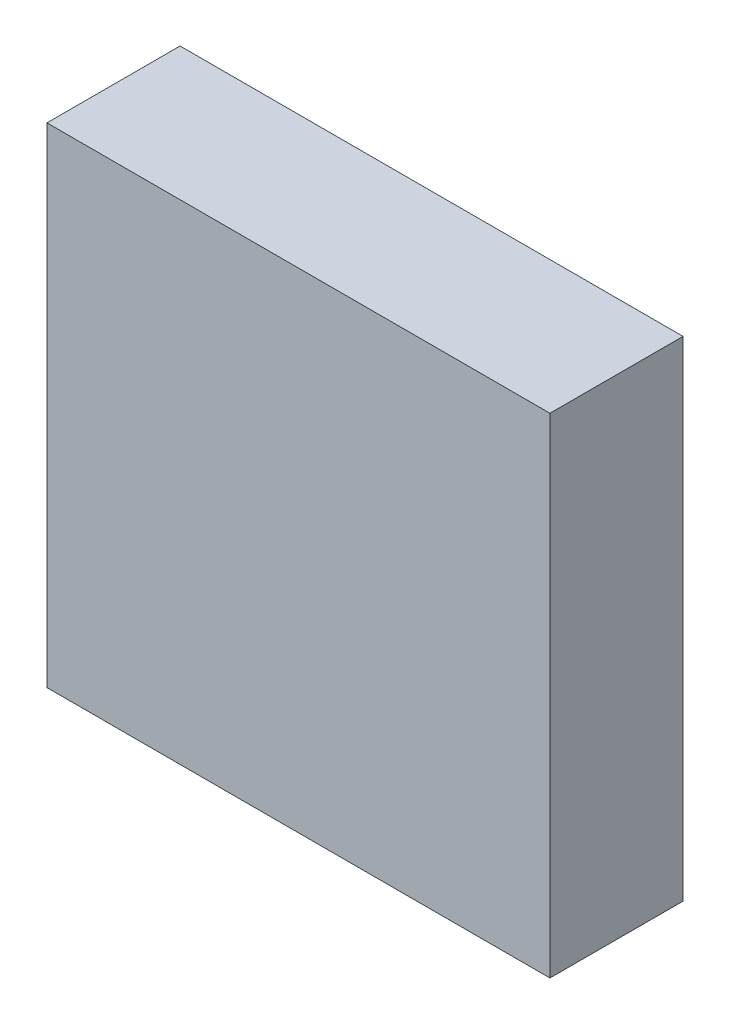
ISO-10303-21;
HEADER;
FILE_DESCRIPTION(('STEP AP214'),'2;1');
FILE_NAME('part.step','',(''),(''),'','','');
FILE_SCHEMA(('AUTOMOTIVE_DESIGN { 1 0 10303 214 1 1 1 1 }'));
ENDSEC;
DATA;
#1=APPLICATION_CONTEXT('core data for automotive mechanical design processes');
#2=APPLICATION_PROTOCOL_DEFINITION('international standard','automotive_design',2000,#1);
#3=PRODUCT_CONTEXT('',#1,'mechanical');
#4=PRODUCT('Part','Part','',(#3));
#5=PRODUCT_RELATED_PRODUCT_CATEGORY('part','',(#4));
#6=PRODUCT_DEFINITION_FORMATION('','',#4);
#7=PRODUCT_DEFINITION_CONTEXT('part definition',#1,'design');
#8=PRODUCT_DEFINITION('design','',#6,#7);
#9=PRODUCT_DEFINITION_SHAPE('','',#8);
#10=(LENGTH_UNIT() NAMED_UNIT(*) SI_UNIT(.MILLI.,.METRE.));
#11=(NAMED_UNIT(*) PLANE_ANGLE_UNIT() SI_UNIT($,.RADIAN.));
#12=(NAMED_UNIT(*) SI_UNIT($,.STERADIAN.) SOLID_ANGLE_UNIT());
#13=UNCERTAINTY_MEASURE_WITH_UNIT(LENGTH_MEASURE(1.E-05),#10,'distance_accuracy_value','');
#14=(GEOMETRIC_REPRESENTATION_CONTEXT(3) GLOBAL_UNCERTAINTY_ASSIGNED_CONTEXT((#13)) GLOBAL_UNIT_ASSIGNED_CONTEXT((#10,
#11,#12)) REPRESENTATION_CONTEXT('',''));
#15=CARTESIAN_POINT('',(0.,0.,0.));
#16=DIRECTION('',(0.,0.,1.));
#17=DIRECTION('',(1.,0.,0.));
#18=AXIS2_PLACEMENT_3D('',#15,#16,#17);
#19=CARTESIAN_POINT('',(1.439738379477,-1.399987299975,0.762001524003));
#20=DIRECTION('',(0.,0.,1.));
#21=DIRECTION('',(0.,1.,0.));
#22=AXIS2_PLACEMENT_3D('',#19,#20,#21);
#23=PLANE('',#22);
#24=DIRECTION('',(1.,0.,0.));
#25=VECTOR('',#24,1.);
#26=CARTESIAN_POINT('',(1.27000254999954E-05,1.400012700025,0.762001524003));
#27=LINE('',#26,#25);
#28=CARTESIAN_POINT('',(-1.439712979426,1.400012700025,0.762001524003));
#29=VERTEX_POINT('',#28);
#30=CARTESIAN_POINT('',(1.439738379477,1.400012700025,0.762001524003));
#31=VERTEX_POINT('',#30);
#32=EDGE_CURVE('E77',#29,#31,#27,.T.);
#33=ORIENTED_EDGE('',*,*,#32,.F.);
#34=DIRECTION('',(0.,1.,0.));
#35=VECTOR('',#34,1.);
#36=CARTESIAN_POINT('',(-1.439712979426,1.27000249999613E-05,0.762001524003));
#37=LINE('',#36,#35);
#38=CARTESIAN_POINT('',(-1.439712979426,-1.399987299975,0.762001524003));
#39=VERTEX_POINT('',#38);
#40=EDGE_CURVE('E59',#39,#29,#37,.T.);
#41=ORIENTED_EDGE('',*,*,#40,.F.);
#42=DIRECTION('',(1.,0.,0.));
#43=VECTOR('',#42,1.);
#44=CARTESIAN_POINT('',(1.27000254999954E-05,-1.399987299975,0.762001524003));
#45=LINE('',#44,#43);
#46=CARTESIAN_POINT('',(1.439738379477,-1.399987299975,0.762001524003));
#47=VERTEX_POINT('',#46);
#48=EDGE_CURVE('E21',#39,#47,#45,.T.);
#49=ORIENTED_EDGE('',*,*,#48,.T.);
#50=DIRECTION('',(0.,1.,0.));
#51=VECTOR('',#50,1.);
#52=CARTESIAN_POINT('',(1.439738379477,1.27000249999613E-05,0.762001524003));
#53=LINE('',#52,#51);
#54=EDGE_CURVE('E56',#47,#31,#53,.T.);
#55=ORIENTED_EDGE('',*,*,#54,.T.);
#56=EDGE_LOOP('',(#33,#41,#49,#55));
#57=FACE_BOUND('',#56,.T.);
#58=ADVANCED_FACE('F17',(#57),#23,.T.);
#59=CARTESIAN_POINT('',(-1.439712979426,-1.399987299975,0.));
#60=DIRECTION('',(0.,1.,0.));
#61=DIRECTION('',(0.,0.,1.));
#62=AXIS2_PLACEMENT_3D('',#59,#60,#61);
#63=PLANE('',#62);
#64=DIRECTION('',(0.,0.,1.));
#65=VECTOR('',#64,1.);
#66=CARTESIAN_POINT('',(-1.439712979426,-1.399987299975,0.3810007620015));
#67=LINE('',#66,#65);
#68=CARTESIAN_POINT('',(-1.439712979426,-1.399987299975,0.));
#69=VERTEX_POINT('',#68);
#70=EDGE_CURVE('E79',#69,#39,#67,.T.);
#71=ORIENTED_EDGE('',*,*,#70,.F.);
#72=DIRECTION('',(1.,0.,0.));
#73=VECTOR('',#72,1.);
#74=CARTESIAN_POINT('',(1.27000254999954E-05,-1.399987299975,0.));
#75=LINE('',#74,#73);
#76=CARTESIAN_POINT('',(1.439738379477,-1.399987299975,0.));
#77=VERTEX_POINT('',#76);
#78=EDGE_CURVE('E74',#69,#77,#75,.T.);
#79=ORIENTED_EDGE('',*,*,#78,.T.);
#80=DIRECTION('',(0.,0.,1.));
#81=VECTOR('',#80,1.);
#82=CARTESIAN_POINT('',(1.439738379477,-1.399987299975,0.3810007620015));
#83=LINE('',#82,#81);
#84=EDGE_CURVE('E64',#77,#47,#83,.T.);
#85=ORIENTED_EDGE('',*,*,#84,.T.);
#86=ORIENTED_EDGE('',*,*,#48,.F.);
#87=EDGE_LOOP('',(#71,#79,#85,#86));
#88=FACE_BOUND('',#87,.T.);
#89=ADVANCED_FACE('F73',(#88),#63,.F.);
#90=CARTESIAN_POINT('',(1.439738379477,-1.399987299975,0.));
#91=DIRECTION('',(-1.,0.,0.));
#92=DIRECTION('',(0.,0.,1.));
#93=AXIS2_PLACEMENT_3D('',#90,#91,#92);
#94=PLANE('',#93);
#95=ORIENTED_EDGE('',*,*,#54,.F.);
#96=ORIENTED_EDGE('',*,*,#84,.F.);
#97=DIRECTION('',(0.,1.,0.));
#98=VECTOR('',#97,1.);
#99=CARTESIAN_POINT('',(1.439738379477,1.27000249999613E-05,0.));
#100=LINE('',#99,#98);
#101=CARTESIAN_POINT('',(1.439738379477,1.400012700025,0.));
#102=VERTEX_POINT('',#101);
#103=EDGE_CURVE('E84',#77,#102,#100,.T.);
#104=ORIENTED_EDGE('',*,*,#103,.T.);
#105=DIRECTION('',(0.,0.,-1.));
#106=VECTOR('',#105,1.);
#107=CARTESIAN_POINT('',(1.439738379477,1.400012700025,0.3810007620015));
#108=LINE('',#107,#106);
#109=EDGE_CURVE('E70',#31,#102,#108,.T.);
#110=ORIENTED_EDGE('',*,*,#109,.F.);
#111=EDGE_LOOP('',(#95,#96,#104,#110));
#112=FACE_BOUND('',#111,.T.);
#113=ADVANCED_FACE('F67',(#112),#94,.F.);
#114=CARTESIAN_POINT('',(-1.439712979426,1.400012700025,0.));
#115=DIRECTION('',(0.,1.,0.));
#116=DIRECTION('',(0.,0.,1.));
#117=AXIS2_PLACEMENT_3D('',#114,#115,#116);
#118=PLANE('',#117);
#119=DIRECTION('',(0.,0.,-1.));
#120=VECTOR('',#119,1.);
#121=CARTESIAN_POINT('',(-1.439712979426,1.400012700025,0.3810007620015));
#122=LINE('',#121,#120);
#123=CARTESIAN_POINT('',(-1.439712979426,1.400012700025,0.));
#124=VERTEX_POINT('',#123);
#125=EDGE_CURVE('E35',#29,#124,#122,.T.);
#126=ORIENTED_EDGE('',*,*,#125,.F.);
#127=ORIENTED_EDGE('',*,*,#32,.T.);
#128=ORIENTED_EDGE('',*,*,#109,.T.);
#129=DIRECTION('',(-1.,0.,0.));
#130=VECTOR('',#129,1.);
#131=CARTESIAN_POINT('',(1.27000254999954E-05,1.400012700025,0.));
#132=LINE('',#131,#130);
#133=EDGE_CURVE('E27',#102,#124,#132,.T.);
#134=ORIENTED_EDGE('',*,*,#133,.T.);
#135=EDGE_LOOP('',(#126,#127,#128,#134));
#136=FACE_BOUND('',#135,.T.);
#137=ADVANCED_FACE('F89',(#136),#118,.T.);
#138=CARTESIAN_POINT('',(-1.439712979426,-1.399987299975,0.));
#139=DIRECTION('',(-1.,0.,0.));
#140=DIRECTION('',(0.,0.,1.));
#141=AXIS2_PLACEMENT_3D('',#138,#139,#140);
#142=PLANE('',#141);
#143=ORIENTED_EDGE('',*,*,#40,.T.);
#144=ORIENTED_EDGE('',*,*,#125,.T.);
#145=DIRECTION('',(0.,-1.,0.));
#146=VECTOR('',#145,1.);
#147=CARTESIAN_POINT('',(-1.439712979426,1.27000249999613E-05,0.));
#148=LINE('',#147,#146);
#149=EDGE_CURVE('E11',#124,#69,#148,.T.);
#150=ORIENTED_EDGE('',*,*,#149,.T.);
#151=ORIENTED_EDGE('',*,*,#70,.T.);
#152=EDGE_LOOP('',(#143,#144,#150,#151));
#153=FACE_BOUND('',#152,.T.);
#154=ADVANCED_FACE('F91',(#153),#142,.T.);
#155=CARTESIAN_POINT('',(1.439738379477,-1.399987299975,0.));
#156=DIRECTION('',(0.,0.,1.));
#157=DIRECTION('',(0.,1.,0.));
#158=AXIS2_PLACEMENT_3D('',#155,#156,#157);
#159=PLANE('',#158);
#160=ORIENTED_EDGE('',*,*,#133,.F.);
#161=ORIENTED_EDGE('',*,*,#103,.F.);
#162=ORIENTED_EDGE('',*,*,#78,.F.);
#163=ORIENTED_EDGE('',*,*,#149,.F.);
#164=EDGE_LOOP('',(#160,#161,#162,#163));
#165=FACE_BOUND('',#164,.T.);
#166=ADVANCED_FACE('F19',(#165),#159,.F.);
#167=CLOSED_SHELL('',(#58,#89,#113,#137,#154,#166));
#168=MANIFOLD_SOLID_BREP('B1',#167);
#169=ADVANCED_BREP_SHAPE_REPRESENTATION('',(#18,#168),#14);
#170=SHAPE_DEFINITION_REPRESENTATION(#9,#169);
ENDSEC;
END-ISO-10303-21;
